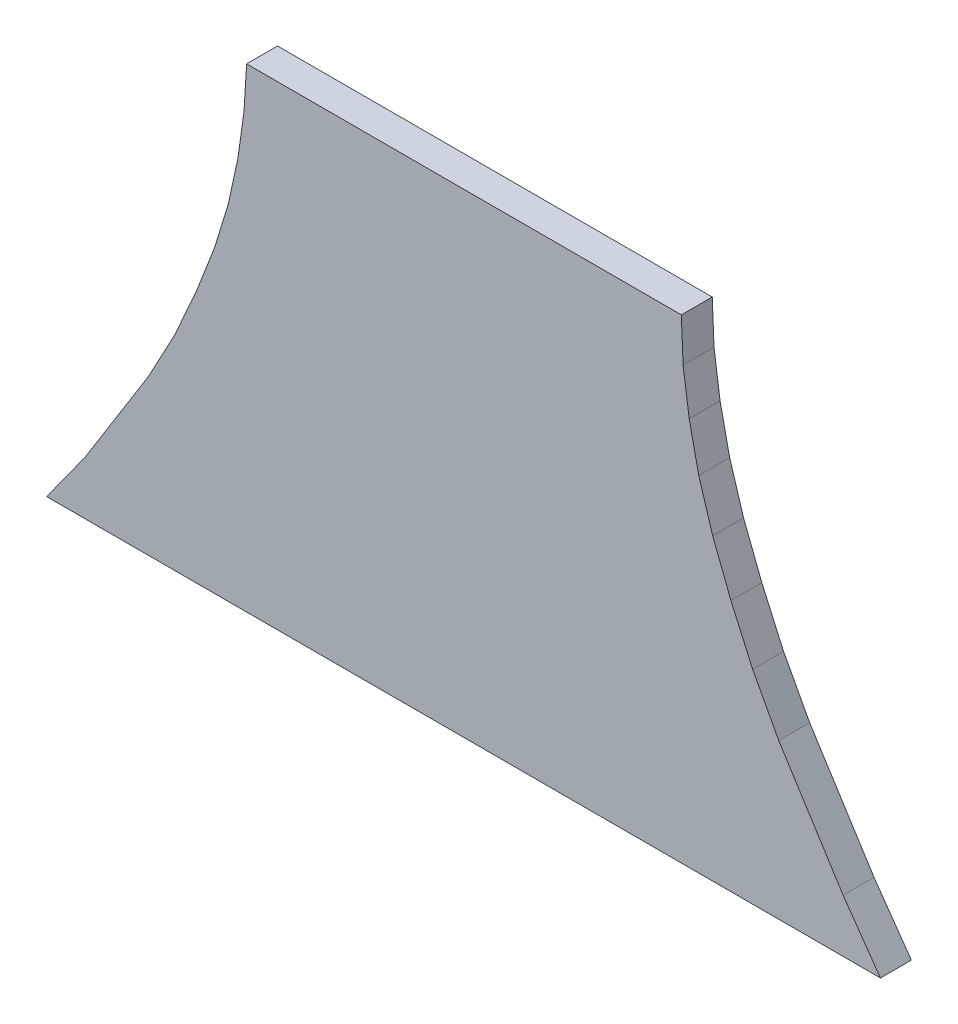
ISO-10303-21;
HEADER;
FILE_DESCRIPTION(('STEP AP214'),'2;1');
FILE_NAME('part.step','',(''),(''),'','','');
FILE_SCHEMA(('AUTOMOTIVE_DESIGN { 1 0 10303 214 1 1 1 1 }'));
ENDSEC;
DATA;
#1=APPLICATION_CONTEXT('core data for automotive mechanical design processes');
#2=APPLICATION_PROTOCOL_DEFINITION('international standard','automotive_design',2000,#1);
#3=PRODUCT_CONTEXT('',#1,'mechanical');
#4=PRODUCT('Part','Part','',(#3));
#5=PRODUCT_RELATED_PRODUCT_CATEGORY('part','',(#4));
#6=PRODUCT_DEFINITION_FORMATION('','',#4);
#7=PRODUCT_DEFINITION_CONTEXT('part definition',#1,'design');
#8=PRODUCT_DEFINITION('design','',#6,#7);
#9=PRODUCT_DEFINITION_SHAPE('','',#8);
#10=(LENGTH_UNIT() NAMED_UNIT(*) SI_UNIT(.MILLI.,.METRE.));
#11=(NAMED_UNIT(*) PLANE_ANGLE_UNIT() SI_UNIT($,.RADIAN.));
#12=(NAMED_UNIT(*) SI_UNIT($,.STERADIAN.) SOLID_ANGLE_UNIT());
#13=UNCERTAINTY_MEASURE_WITH_UNIT(LENGTH_MEASURE(1.E-05),#10,'distance_accuracy_value','');
#14=(GEOMETRIC_REPRESENTATION_CONTEXT(3) GLOBAL_UNCERTAINTY_ASSIGNED_CONTEXT((#13)) GLOBAL_UNIT_ASSIGNED_CONTEXT((#10,
#11,#12)) REPRESENTATION_CONTEXT('',''));
#15=CARTESIAN_POINT('',(0.,0.,0.));
#16=DIRECTION('',(0.,0.,1.));
#17=DIRECTION('',(1.,0.,0.));
#18=AXIS2_PLACEMENT_3D('',#15,#16,#17);
#19=CARTESIAN_POINT('',(110.217002868652,98.7460021972656,0.));
#20=DIRECTION('',(0.998123869365912,-0.0612269662977066,0.));
#21=DIRECTION('',(-0.0612269662977066,-0.998123869365912,0.));
#22=AXIS2_PLACEMENT_3D('',#19,#20,#21);
#23=PLANE('',#22);
#24=DIRECTION('',(-0.0612269662977066,-0.998123869365912,0.));
#25=VECTOR('',#24,1.);
#26=CARTESIAN_POINT('',(110.217002868652,98.7460021972656,0.03556));
#27=LINE('',#26,#25);
#28=CARTESIAN_POINT('',(110.217002868652,98.7460021972656,0.03556));
#29=VERTEX_POINT('',#28);
#30=CARTESIAN_POINT('',(110.213996887207,98.6969985961914,0.03556));
#31=VERTEX_POINT('',#30);
#32=EDGE_CURVE('E11',#29,#31,#27,.T.);
#33=ORIENTED_EDGE('',*,*,#32,.F.);
#34=DIRECTION('',(0.,0.,1.));
#35=VECTOR('',#34,1.);
#36=CARTESIAN_POINT('',(110.217002868652,98.7460021972656,0.));
#37=LINE('',#36,#35);
#38=CARTESIAN_POINT('',(110.217002868652,98.7460021972656,0.));
#39=VERTEX_POINT('',#38);
#40=EDGE_CURVE('E24',#39,#29,#37,.T.);
#41=ORIENTED_EDGE('',*,*,#40,.F.);
#42=DIRECTION('',(-0.0612269662977066,-0.998123869365912,0.));
#43=VECTOR('',#42,1.);
#44=CARTESIAN_POINT('',(110.217002868652,98.7460021972656,0.));
#45=LINE('',#44,#43);
#46=CARTESIAN_POINT('',(110.213996887207,98.6969985961914,0.));
#47=VERTEX_POINT('',#46);
#48=EDGE_CURVE('E172',#39,#47,#45,.T.);
#49=ORIENTED_EDGE('',*,*,#48,.T.);
#50=DIRECTION('',(0.,0.,1.));
#51=VECTOR('',#50,1.);
#52=CARTESIAN_POINT('',(110.213996887207,98.6969985961914,0.));
#53=LINE('',#52,#51);
#54=EDGE_CURVE('E37',#47,#31,#53,.T.);
#55=ORIENTED_EDGE('',*,*,#54,.T.);
#56=EDGE_LOOP('',(#33,#41,#49,#55));
#57=FACE_BOUND('',#56,.T.);
#58=ADVANCED_FACE('F17',(#57),#23,.F.);
#59=CARTESIAN_POINT('',(110.213996887207,98.6969985961914,0.));
#60=DIRECTION('',(0.990350460296549,-0.138585590125429,0.));
#61=DIRECTION('',(-0.138585590125429,-0.990350460296549,0.));
#62=AXIS2_PLACEMENT_3D('',#59,#60,#61);
#63=PLANE('',#62);
#64=DIRECTION('',(-0.138585590125429,-0.990350460296549,0.));
#65=VECTOR('',#64,1.);
#66=CARTESIAN_POINT('',(110.213996887207,98.6969985961914,0.03556));
#67=LINE('',#66,#65);
#68=CARTESIAN_POINT('',(110.207000732422,98.6470031738281,0.03556));
#69=VERTEX_POINT('',#68);
#70=EDGE_CURVE('E308',#31,#69,#67,.T.);
#71=ORIENTED_EDGE('',*,*,#70,.F.);
#72=ORIENTED_EDGE('',*,*,#54,.F.);
#73=DIRECTION('',(-0.138585590125429,-0.990350460296549,0.));
#74=VECTOR('',#73,1.);
#75=CARTESIAN_POINT('',(110.213996887207,98.6969985961914,0.));
#76=LINE('',#75,#74);
#77=CARTESIAN_POINT('',(110.207000732422,98.6470031738281,0.));
#78=VERTEX_POINT('',#77);
#79=EDGE_CURVE('E305',#47,#78,#76,.T.);
#80=ORIENTED_EDGE('',*,*,#79,.T.);
#81=DIRECTION('',(0.,0.,1.));
#82=VECTOR('',#81,1.);
#83=CARTESIAN_POINT('',(110.207000732422,98.6470031738281,0.));
#84=LINE('',#83,#82);
#85=EDGE_CURVE('E303',#78,#69,#84,.T.);
#86=ORIENTED_EDGE('',*,*,#85,.T.);
#87=EDGE_LOOP('',(#71,#72,#80,#86));
#88=FACE_BOUND('',#87,.T.);
#89=ADVANCED_FACE('F316',(#88),#63,.F.);
#90=CARTESIAN_POINT('',(110.207000732422,98.6470031738281,0.));
#91=DIRECTION('',(0.97751690746619,-0.210857050196895,0.));
#92=DIRECTION('',(-0.210857050196895,-0.97751690746619,0.));
#93=AXIS2_PLACEMENT_3D('',#90,#91,#92);
#94=PLANE('',#93);
#95=DIRECTION('',(-0.210857050196895,-0.97751690746619,0.));
#96=VECTOR('',#95,1.);
#97=CARTESIAN_POINT('',(110.207000732422,98.6470031738281,0.03556));
#98=LINE('',#97,#96);
#99=CARTESIAN_POINT('',(110.195999145508,98.5960006713867,0.03556));
#100=VERTEX_POINT('',#99);
#101=EDGE_CURVE('E300',#69,#100,#98,.T.);
#102=ORIENTED_EDGE('',*,*,#101,.F.);
#103=ORIENTED_EDGE('',*,*,#85,.F.);
#104=DIRECTION('',(-0.210857050196895,-0.97751690746619,0.));
#105=VECTOR('',#104,1.);
#106=CARTESIAN_POINT('',(110.207000732422,98.6470031738281,0.));
#107=LINE('',#106,#105);
#108=CARTESIAN_POINT('',(110.195999145508,98.5960006713867,0.));
#109=VERTEX_POINT('',#108);
#110=EDGE_CURVE('E297',#78,#109,#107,.T.);
#111=ORIENTED_EDGE('',*,*,#110,.T.);
#112=DIRECTION('',(0.,0.,1.));
#113=VECTOR('',#112,1.);
#114=CARTESIAN_POINT('',(110.195999145508,98.5960006713867,0.));
#115=LINE('',#114,#113);
#116=EDGE_CURVE('E295',#109,#100,#115,.T.);
#117=ORIENTED_EDGE('',*,*,#116,.T.);
#118=EDGE_LOOP('',(#102,#103,#111,#117));
#119=FACE_BOUND('',#118,.T.);
#120=ADVANCED_FACE('F322',(#119),#94,.F.);
#121=CARTESIAN_POINT('',(110.195999145508,98.5960006713867,0.));
#122=DIRECTION('',(0.955788104078501,-0.294056287302321,0.));
#123=DIRECTION('',(-0.294056287302321,-0.955788104078501,0.));
#124=AXIS2_PLACEMENT_3D('',#121,#122,#123);
#125=PLANE('',#124);
#126=DIRECTION('',(-0.294056287302321,-0.955788104078501,0.));
#127=VECTOR('',#126,1.);
#128=CARTESIAN_POINT('',(110.195999145508,98.5960006713867,0.03556));
#129=LINE('',#128,#127);
#130=CARTESIAN_POINT('',(110.180000305176,98.5439987182617,0.03556));
#131=VERTEX_POINT('',#130);
#132=EDGE_CURVE('E292',#100,#131,#129,.T.);
#133=ORIENTED_EDGE('',*,*,#132,.F.);
#134=ORIENTED_EDGE('',*,*,#116,.F.);
#135=DIRECTION('',(-0.294056287302321,-0.955788104078501,0.));
#136=VECTOR('',#135,1.);
#137=CARTESIAN_POINT('',(110.195999145508,98.5960006713867,0.));
#138=LINE('',#137,#136);
#139=CARTESIAN_POINT('',(110.180000305176,98.5439987182617,0.));
#140=VERTEX_POINT('',#139);
#141=EDGE_CURVE('E289',#109,#140,#138,.T.);
#142=ORIENTED_EDGE('',*,*,#141,.T.);
#143=DIRECTION('',(0.,0.,1.));
#144=VECTOR('',#143,1.);
#145=CARTESIAN_POINT('',(110.180000305176,98.5439987182617,0.));
#146=LINE('',#145,#144);
#147=EDGE_CURVE('E287',#140,#131,#146,.T.);
#148=ORIENTED_EDGE('',*,*,#147,.T.);
#149=EDGE_LOOP('',(#133,#134,#142,#148));
#150=FACE_BOUND('',#149,.T.);
#151=ADVANCED_FACE('F324',(#150),#125,.F.);
#152=CARTESIAN_POINT('',(110.180000305176,98.5439987182617,0.));
#153=DIRECTION('',(0.931984901482187,-0.362497094345925,0.));
#154=DIRECTION('',(-0.362497094345925,-0.931984901482187,0.));
#155=AXIS2_PLACEMENT_3D('',#152,#153,#154);
#156=PLANE('',#155);
#157=DIRECTION('',(-0.362497094345925,-0.931984901482187,0.));
#158=VECTOR('',#157,1.);
#159=CARTESIAN_POINT('',(110.180000305176,98.5439987182617,0.03556));
#160=LINE('',#159,#158);
#161=CARTESIAN_POINT('',(110.158996582031,98.4899978637695,0.03556));
#162=VERTEX_POINT('',#161);
#163=EDGE_CURVE('E284',#131,#162,#160,.T.);
#164=ORIENTED_EDGE('',*,*,#163,.F.);
#165=ORIENTED_EDGE('',*,*,#147,.F.);
#166=DIRECTION('',(-0.362497094345925,-0.931984901482187,0.));
#167=VECTOR('',#166,1.);
#168=CARTESIAN_POINT('',(110.180000305176,98.5439987182617,0.));
#169=LINE('',#168,#167);
#170=CARTESIAN_POINT('',(110.158996582031,98.4899978637695,0.));
#171=VERTEX_POINT('',#170);
#172=EDGE_CURVE('E281',#140,#171,#169,.T.);
#173=ORIENTED_EDGE('',*,*,#172,.T.);
#174=DIRECTION('',(0.,0.,1.));
#175=VECTOR('',#174,1.);
#176=CARTESIAN_POINT('',(110.158996582031,98.4899978637695,0.));
#177=LINE('',#176,#175);
#178=EDGE_CURVE('E279',#171,#162,#177,.T.);
#179=ORIENTED_EDGE('',*,*,#178,.T.);
#180=EDGE_LOOP('',(#164,#165,#173,#179));
#181=FACE_BOUND('',#180,.T.);
#182=ADVANCED_FACE('F329',(#181),#156,.F.);
#183=CARTESIAN_POINT('',(110.158996582031,98.4899978637695,0.));
#184=DIRECTION('',(0.913174265858923,-0.407569331737579,0.));
#185=DIRECTION('',(-0.407569331737579,-0.913174265858923,0.));
#186=AXIS2_PLACEMENT_3D('',#183,#184,#185);
#187=PLANE('',#186);
#188=DIRECTION('',(-0.407569331737579,-0.913174265858923,0.));
#189=VECTOR('',#188,1.);
#190=CARTESIAN_POINT('',(110.158996582031,98.4899978637695,0.03556));
#191=LINE('',#190,#189);
#192=CARTESIAN_POINT('',(110.134002685547,98.4339981079102,0.03556));
#193=VERTEX_POINT('',#192);
#194=EDGE_CURVE('E276',#162,#193,#191,.T.);
#195=ORIENTED_EDGE('',*,*,#194,.F.);
#196=ORIENTED_EDGE('',*,*,#178,.F.);
#197=DIRECTION('',(-0.407569331737579,-0.913174265858923,0.));
#198=VECTOR('',#197,1.);
#199=CARTESIAN_POINT('',(110.158996582031,98.4899978637695,0.));
#200=LINE('',#199,#198);
#201=CARTESIAN_POINT('',(110.134002685547,98.4339981079102,0.));
#202=VERTEX_POINT('',#201);
#203=EDGE_CURVE('E273',#171,#202,#200,.T.);
#204=ORIENTED_EDGE('',*,*,#203,.T.);
#205=DIRECTION('',(0.,0.,1.));
#206=VECTOR('',#205,1.);
#207=CARTESIAN_POINT('',(110.134002685547,98.4339981079102,0.));
#208=LINE('',#207,#206);
#209=EDGE_CURVE('E271',#202,#193,#208,.T.);
#210=ORIENTED_EDGE('',*,*,#209,.T.);
#211=EDGE_LOOP('',(#195,#196,#204,#210));
#212=FACE_BOUND('',#211,.T.);
#213=ADVANCED_FACE('F332',(#212),#187,.F.);
#214=CARTESIAN_POINT('',(110.134002685547,98.4339981079102,0.));
#215=DIRECTION('',(0.881437120762782,-0.472301389095371,0.));
#216=DIRECTION('',(-0.472301389095371,-0.881437120762782,0.));
#217=AXIS2_PLACEMENT_3D('',#214,#215,#216);
#218=PLANE('',#217);
#219=DIRECTION('',(-0.472301389095371,-0.881437120762782,0.));
#220=VECTOR('',#219,1.);
#221=CARTESIAN_POINT('',(110.134002685547,98.4339981079102,0.03556));
#222=LINE('',#221,#220);
#223=CARTESIAN_POINT('',(110.103996276855,98.3779983520508,0.03556));
#224=VERTEX_POINT('',#223);
#225=EDGE_CURVE('E268',#193,#224,#222,.T.);
#226=ORIENTED_EDGE('',*,*,#225,.F.);
#227=ORIENTED_EDGE('',*,*,#209,.F.);
#228=DIRECTION('',(-0.472301389095371,-0.881437120762782,0.));
#229=VECTOR('',#228,1.);
#230=CARTESIAN_POINT('',(110.134002685547,98.4339981079102,0.));
#231=LINE('',#230,#229);
#232=CARTESIAN_POINT('',(110.103996276855,98.3779983520508,0.));
#233=VERTEX_POINT('',#232);
#234=EDGE_CURVE('E265',#202,#233,#231,.T.);
#235=ORIENTED_EDGE('',*,*,#234,.T.);
#236=DIRECTION('',(0.,0.,1.));
#237=VECTOR('',#236,1.);
#238=CARTESIAN_POINT('',(110.103996276855,98.3779983520508,0.));
#239=LINE('',#238,#237);
#240=EDGE_CURVE('E263',#233,#224,#239,.T.);
#241=ORIENTED_EDGE('',*,*,#240,.T.);
#242=EDGE_LOOP('',(#226,#227,#235,#241));
#243=FACE_BOUND('',#242,.T.);
#244=ADVANCED_FACE('F337',(#243),#218,.F.);
#245=CARTESIAN_POINT('',(110.103996276855,98.3779983520508,0.));
#246=DIRECTION('',(0.848405219145403,-0.529347318994667,0.));
#247=DIRECTION('',(-0.529347318994667,-0.848405219145403,0.));
#248=AXIS2_PLACEMENT_3D('',#245,#246,#247);
#249=PLANE('',#248);
#250=DIRECTION('',(-0.529347318994667,-0.848405219145403,0.));
#251=VECTOR('',#250,1.);
#252=CARTESIAN_POINT('',(110.103996276855,98.3779983520508,0.03556));
#253=LINE('',#252,#251);
#254=CARTESIAN_POINT('',(110.03099822998,98.2610015869141,0.03556));
#255=VERTEX_POINT('',#254);
#256=EDGE_CURVE('E260',#224,#255,#253,.T.);
#257=ORIENTED_EDGE('',*,*,#256,.F.);
#258=ORIENTED_EDGE('',*,*,#240,.F.);
#259=DIRECTION('',(-0.529347318994667,-0.848405219145403,0.));
#260=VECTOR('',#259,1.);
#261=CARTESIAN_POINT('',(110.103996276855,98.3779983520508,0.));
#262=LINE('',#261,#260);
#263=CARTESIAN_POINT('',(110.03099822998,98.2610015869141,0.));
#264=VERTEX_POINT('',#263);
#265=EDGE_CURVE('E257',#233,#264,#262,.T.);
#266=ORIENTED_EDGE('',*,*,#265,.T.);
#267=DIRECTION('',(0.,0.,1.));
#268=VECTOR('',#267,1.);
#269=CARTESIAN_POINT('',(110.03099822998,98.2610015869141,0.));
#270=LINE('',#269,#268);
#271=EDGE_CURVE('E255',#264,#255,#270,.T.);
#272=ORIENTED_EDGE('',*,*,#271,.T.);
#273=EDGE_LOOP('',(#257,#258,#266,#272));
#274=FACE_BOUND('',#273,.T.);
#275=ADVANCED_FACE('F340',(#274),#249,.F.);
#276=CARTESIAN_POINT('',(110.03099822998,98.2610015869141,0.));
#277=DIRECTION('',(0.811058866055084,-0.584964542338628,0.));
#278=DIRECTION('',(-0.584964542338628,-0.811058866055084,0.));
#279=AXIS2_PLACEMENT_3D('',#276,#277,#278);
#280=PLANE('',#279);
#281=DIRECTION('',(-0.584964542338628,-0.811058866055084,0.));
#282=VECTOR('',#281,1.);
#283=CARTESIAN_POINT('',(110.03099822998,98.2610015869141,0.03556));
#284=LINE('',#283,#282);
#285=CARTESIAN_POINT('',(109.986999511719,98.1999969482422,0.03556));
#286=VERTEX_POINT('',#285);
#287=EDGE_CURVE('E252',#255,#286,#284,.T.);
#288=ORIENTED_EDGE('',*,*,#287,.F.);
#289=ORIENTED_EDGE('',*,*,#271,.F.);
#290=DIRECTION('',(-0.584964542338628,-0.811058866055084,0.));
#291=VECTOR('',#290,1.);
#292=CARTESIAN_POINT('',(110.03099822998,98.2610015869141,0.));
#293=LINE('',#292,#291);
#294=CARTESIAN_POINT('',(109.986999511719,98.1999969482422,0.));
#295=VERTEX_POINT('',#294);
#296=EDGE_CURVE('E249',#264,#295,#293,.T.);
#297=ORIENTED_EDGE('',*,*,#296,.T.);
#298=DIRECTION('',(0.,0.,1.));
#299=VECTOR('',#298,1.);
#300=CARTESIAN_POINT('',(109.986999511719,98.1999969482422,0.));
#301=LINE('',#300,#299);
#302=EDGE_CURVE('E247',#295,#286,#301,.T.);
#303=ORIENTED_EDGE('',*,*,#302,.T.);
#304=EDGE_LOOP('',(#288,#289,#297,#303));
#305=FACE_BOUND('',#304,.T.);
#306=ADVANCED_FACE('F345',(#305),#280,.F.);
#307=CARTESIAN_POINT('',(109.986999511719,98.1999969482422,0.));
#308=DIRECTION('',(0.,1.,0.));
#309=DIRECTION('',(1.,0.,0.));
#310=AXIS2_PLACEMENT_3D('',#307,#308,#309);
#311=PLANE('',#310);
#312=DIRECTION('',(1.,0.,0.));
#313=VECTOR('',#312,1.);
#314=CARTESIAN_POINT('',(109.986999511719,98.1999969482422,0.03556));
#315=LINE('',#314,#313);
#316=CARTESIAN_POINT('',(110.945999145508,98.1999969482422,0.03556));
#317=VERTEX_POINT('',#316);
#318=EDGE_CURVE('E244',#286,#317,#315,.T.);
#319=ORIENTED_EDGE('',*,*,#318,.F.);
#320=ORIENTED_EDGE('',*,*,#302,.F.);
#321=DIRECTION('',(1.,0.,0.));
#322=VECTOR('',#321,1.);
#323=CARTESIAN_POINT('',(109.986999511719,98.1999969482422,0.));
#324=LINE('',#323,#322);
#325=CARTESIAN_POINT('',(110.945999145508,98.1999969482422,0.));
#326=VERTEX_POINT('',#325);
#327=EDGE_CURVE('E241',#295,#326,#324,.T.);
#328=ORIENTED_EDGE('',*,*,#327,.T.);
#329=DIRECTION('',(0.,0.,1.));
#330=VECTOR('',#329,1.);
#331=CARTESIAN_POINT('',(110.945999145508,98.1999969482422,0.));
#332=LINE('',#331,#330);
#333=EDGE_CURVE('E239',#326,#317,#332,.T.);
#334=ORIENTED_EDGE('',*,*,#333,.T.);
#335=EDGE_LOOP('',(#319,#320,#328,#334));
#336=FACE_BOUND('',#335,.T.);
#337=ADVANCED_FACE('F348',(#336),#311,.F.);
#338=CARTESIAN_POINT('',(110.945999145508,98.1999969482422,0.));
#339=DIRECTION('',(-0.817364280598029,-0.576121196279451,0.));
#340=DIRECTION('',(-0.576121196279451,0.817364280598029,0.));
#341=AXIS2_PLACEMENT_3D('',#338,#339,#340);
#342=PLANE('',#341);
#343=DIRECTION('',(-0.576121196279451,0.817364280598029,0.));
#344=VECTOR('',#343,1.);
#345=CARTESIAN_POINT('',(110.945999145508,98.1999969482422,0.03556));
#346=LINE('',#345,#344);
#347=CARTESIAN_POINT('',(110.90299987793,98.2610015869141,0.03556));
#348=VERTEX_POINT('',#347);
#349=EDGE_CURVE('E236',#317,#348,#346,.T.);
#350=ORIENTED_EDGE('',*,*,#349,.F.);
#351=ORIENTED_EDGE('',*,*,#333,.F.);
#352=DIRECTION('',(-0.576121196279451,0.817364280598029,0.));
#353=VECTOR('',#352,1.);
#354=CARTESIAN_POINT('',(110.945999145508,98.1999969482422,0.));
#355=LINE('',#354,#353);
#356=CARTESIAN_POINT('',(110.90299987793,98.2610015869141,0.));
#357=VERTEX_POINT('',#356);
#358=EDGE_CURVE('E233',#326,#357,#355,.T.);
#359=ORIENTED_EDGE('',*,*,#358,.T.);
#360=DIRECTION('',(0.,0.,1.));
#361=VECTOR('',#360,1.);
#362=CARTESIAN_POINT('',(110.90299987793,98.2610015869141,0.));
#363=LINE('',#362,#361);
#364=EDGE_CURVE('E231',#357,#348,#363,.T.);
#365=ORIENTED_EDGE('',*,*,#364,.T.);
#366=EDGE_LOOP('',(#350,#351,#359,#365));
#367=FACE_BOUND('',#366,.T.);
#368=ADVANCED_FACE('F353',(#367),#342,.F.);
#369=CARTESIAN_POINT('',(110.90299987793,98.2610015869141,0.));
#370=DIRECTION('',(-0.845146924510356,-0.534534073741503,0.));
#371=DIRECTION('',(-0.534534073741503,0.845146924510356,0.));
#372=AXIS2_PLACEMENT_3D('',#369,#370,#371);
#373=PLANE('',#372);
#374=DIRECTION('',(-0.534534073741503,0.845146924510356,0.));
#375=VECTOR('',#374,1.);
#376=CARTESIAN_POINT('',(110.90299987793,98.2610015869141,0.03556));
#377=LINE('',#376,#375);
#378=CARTESIAN_POINT('',(110.829002380371,98.3779983520508,0.03556));
#379=VERTEX_POINT('',#378);
#380=EDGE_CURVE('E228',#348,#379,#377,.T.);
#381=ORIENTED_EDGE('',*,*,#380,.F.);
#382=ORIENTED_EDGE('',*,*,#364,.F.);
#383=DIRECTION('',(-0.534534073741503,0.845146924510356,0.));
#384=VECTOR('',#383,1.);
#385=CARTESIAN_POINT('',(110.90299987793,98.2610015869141,0.));
#386=LINE('',#385,#384);
#387=CARTESIAN_POINT('',(110.829002380371,98.3779983520508,0.));
#388=VERTEX_POINT('',#387);
#389=EDGE_CURVE('E225',#357,#388,#386,.T.);
#390=ORIENTED_EDGE('',*,*,#389,.T.);
#391=DIRECTION('',(0.,0.,1.));
#392=VECTOR('',#391,1.);
#393=CARTESIAN_POINT('',(110.829002380371,98.3779983520508,0.));
#394=LINE('',#393,#392);
#395=EDGE_CURVE('E223',#388,#379,#394,.T.);
#396=ORIENTED_EDGE('',*,*,#395,.T.);
#397=EDGE_LOOP('',(#381,#382,#390,#396));
#398=FACE_BOUND('',#397,.T.);
#399=ADVANCED_FACE('F356',(#398),#373,.F.);
#400=CARTESIAN_POINT('',(110.829002380371,98.3779983520508,0.));
#401=DIRECTION('',(-0.881487111272596,-0.472208081951478,0.));
#402=DIRECTION('',(-0.472208081951478,0.881487111272596,0.));
#403=AXIS2_PLACEMENT_3D('',#400,#401,#402);
#404=PLANE('',#403);
#405=DIRECTION('',(-0.472208081951478,0.881487111272596,0.));
#406=VECTOR('',#405,1.);
#407=CARTESIAN_POINT('',(110.829002380371,98.3779983520508,0.03556));
#408=LINE('',#407,#406);
#409=CARTESIAN_POINT('',(110.799003601074,98.4339981079102,0.03556));
#410=VERTEX_POINT('',#409);
#411=EDGE_CURVE('E220',#379,#410,#408,.T.);
#412=ORIENTED_EDGE('',*,*,#411,.F.);
#413=ORIENTED_EDGE('',*,*,#395,.F.);
#414=DIRECTION('',(-0.472208081951478,0.881487111272596,0.));
#415=VECTOR('',#414,1.);
#416=CARTESIAN_POINT('',(110.829002380371,98.3779983520508,0.));
#417=LINE('',#416,#415);
#418=CARTESIAN_POINT('',(110.799003601074,98.4339981079102,0.));
#419=VERTEX_POINT('',#418);
#420=EDGE_CURVE('E217',#388,#419,#417,.T.);
#421=ORIENTED_EDGE('',*,*,#420,.T.);
#422=DIRECTION('',(0.,0.,1.));
#423=VECTOR('',#422,1.);
#424=CARTESIAN_POINT('',(110.799003601074,98.4339981079102,0.));
#425=LINE('',#424,#423);
#426=EDGE_CURVE('E215',#419,#410,#425,.T.);
#427=ORIENTED_EDGE('',*,*,#426,.T.);
#428=EDGE_LOOP('',(#412,#413,#421,#427));
#429=FACE_BOUND('',#428,.T.);
#430=ADVANCED_FACE('F361',(#429),#404,.F.);
#431=CARTESIAN_POINT('',(110.799003601074,98.4339981079102,0.));
#432=DIRECTION('',(-0.913127958926813,-0.407673068311058,0.));
#433=DIRECTION('',(-0.407673068311058,0.913127958926813,0.));
#434=AXIS2_PLACEMENT_3D('',#431,#432,#433);
#435=PLANE('',#434);
#436=DIRECTION('',(-0.407673068311058,0.913127958926813,0.));
#437=VECTOR('',#436,1.);
#438=CARTESIAN_POINT('',(110.799003601074,98.4339981079102,0.03556));
#439=LINE('',#438,#437);
#440=CARTESIAN_POINT('',(110.774002075195,98.4899978637695,0.03556));
#441=VERTEX_POINT('',#440);
#442=EDGE_CURVE('E212',#410,#441,#439,.T.);
#443=ORIENTED_EDGE('',*,*,#442,.F.);
#444=ORIENTED_EDGE('',*,*,#426,.F.);
#445=DIRECTION('',(-0.407673068311058,0.913127958926813,0.));
#446=VECTOR('',#445,1.);
#447=CARTESIAN_POINT('',(110.799003601074,98.4339981079102,0.));
#448=LINE('',#447,#446);
#449=CARTESIAN_POINT('',(110.774002075195,98.4899978637695,0.));
#450=VERTEX_POINT('',#449);
#451=EDGE_CURVE('E209',#419,#450,#448,.T.);
#452=ORIENTED_EDGE('',*,*,#451,.T.);
#453=DIRECTION('',(0.,0.,1.));
#454=VECTOR('',#453,1.);
#455=CARTESIAN_POINT('',(110.774002075195,98.4899978637695,0.));
#456=LINE('',#455,#454);
#457=EDGE_CURVE('E207',#450,#441,#456,.T.);
#458=ORIENTED_EDGE('',*,*,#457,.T.);
#459=EDGE_LOOP('',(#443,#444,#452,#458));
#460=FACE_BOUND('',#459,.T.);
#461=ADVANCED_FACE('F364',(#460),#435,.F.);
#462=CARTESIAN_POINT('',(110.774002075195,98.4899978637695,0.));
#463=DIRECTION('',(-0.931984901482187,-0.362497094345925,0.));
#464=DIRECTION('',(-0.362497094345925,0.931984901482187,0.));
#465=AXIS2_PLACEMENT_3D('',#462,#463,#464);
#466=PLANE('',#465);
#467=DIRECTION('',(-0.362497094345925,0.931984901482187,0.));
#468=VECTOR('',#467,1.);
#469=CARTESIAN_POINT('',(110.774002075195,98.4899978637695,0.03556));
#470=LINE('',#469,#468);
#471=CARTESIAN_POINT('',(110.752998352051,98.5439987182617,0.03556));
#472=VERTEX_POINT('',#471);
#473=EDGE_CURVE('E204',#441,#472,#470,.T.);
#474=ORIENTED_EDGE('',*,*,#473,.F.);
#475=ORIENTED_EDGE('',*,*,#457,.F.);
#476=DIRECTION('',(-0.362497094345925,0.931984901482187,0.));
#477=VECTOR('',#476,1.);
#478=CARTESIAN_POINT('',(110.774002075195,98.4899978637695,0.));
#479=LINE('',#478,#477);
#480=CARTESIAN_POINT('',(110.752998352051,98.5439987182617,0.));
#481=VERTEX_POINT('',#480);
#482=EDGE_CURVE('E201',#450,#481,#479,.T.);
#483=ORIENTED_EDGE('',*,*,#482,.T.);
#484=DIRECTION('',(0.,0.,1.));
#485=VECTOR('',#484,1.);
#486=CARTESIAN_POINT('',(110.752998352051,98.5439987182617,0.));
#487=LINE('',#486,#485);
#488=EDGE_CURVE('E199',#481,#472,#487,.T.);
#489=ORIENTED_EDGE('',*,*,#488,.T.);
#490=EDGE_LOOP('',(#474,#475,#483,#489));
#491=FACE_BOUND('',#490,.T.);
#492=ADVANCED_FACE('F369',(#491),#466,.F.);
#493=CARTESIAN_POINT('',(110.752998352051,98.5439987182617,0.));
#494=DIRECTION('',(-0.955788104078501,-0.294056287302321,0.));
#495=DIRECTION('',(-0.294056287302321,0.955788104078501,0.));
#496=AXIS2_PLACEMENT_3D('',#493,#494,#495);
#497=PLANE('',#496);
#498=DIRECTION('',(-0.294056287302321,0.955788104078501,0.));
#499=VECTOR('',#498,1.);
#500=CARTESIAN_POINT('',(110.752998352051,98.5439987182617,0.03556));
#501=LINE('',#500,#499);
#502=CARTESIAN_POINT('',(110.736999511719,98.5960006713867,0.03556));
#503=VERTEX_POINT('',#502);
#504=EDGE_CURVE('E196',#472,#503,#501,.T.);
#505=ORIENTED_EDGE('',*,*,#504,.F.);
#506=ORIENTED_EDGE('',*,*,#488,.F.);
#507=DIRECTION('',(-0.294056287302321,0.955788104078501,0.));
#508=VECTOR('',#507,1.);
#509=CARTESIAN_POINT('',(110.752998352051,98.5439987182617,0.));
#510=LINE('',#509,#508);
#511=CARTESIAN_POINT('',(110.736999511719,98.5960006713867,0.));
#512=VERTEX_POINT('',#511);
#513=EDGE_CURVE('E193',#481,#512,#510,.T.);
#514=ORIENTED_EDGE('',*,*,#513,.T.);
#515=DIRECTION('',(0.,0.,1.));
#516=VECTOR('',#515,1.);
#517=CARTESIAN_POINT('',(110.736999511719,98.5960006713867,0.));
#518=LINE('',#517,#516);
#519=EDGE_CURVE('E191',#512,#503,#518,.T.);
#520=ORIENTED_EDGE('',*,*,#519,.T.);
#521=EDGE_LOOP('',(#505,#506,#514,#520));
#522=FACE_BOUND('',#521,.T.);
#523=ADVANCED_FACE('F372',(#522),#497,.F.);
#524=CARTESIAN_POINT('',(110.736999511719,98.5960006713867,0.));
#525=DIRECTION('',(-0.97751690746619,-0.210857050196895,0.));
#526=DIRECTION('',(-0.210857050196895,0.97751690746619,0.));
#527=AXIS2_PLACEMENT_3D('',#524,#525,#526);
#528=PLANE('',#527);
#529=DIRECTION('',(-0.210857050196895,0.97751690746619,0.));
#530=VECTOR('',#529,1.);
#531=CARTESIAN_POINT('',(110.736999511719,98.5960006713867,0.03556));
#532=LINE('',#531,#530);
#533=CARTESIAN_POINT('',(110.725997924805,98.6470031738281,0.03556));
#534=VERTEX_POINT('',#533);
#535=EDGE_CURVE('E188',#503,#534,#532,.T.);
#536=ORIENTED_EDGE('',*,*,#535,.F.);
#537=ORIENTED_EDGE('',*,*,#519,.F.);
#538=DIRECTION('',(-0.210857050196895,0.97751690746619,0.));
#539=VECTOR('',#538,1.);
#540=CARTESIAN_POINT('',(110.736999511719,98.5960006713867,0.));
#541=LINE('',#540,#539);
#542=CARTESIAN_POINT('',(110.725997924805,98.6470031738281,0.));
#543=VERTEX_POINT('',#542);
#544=EDGE_CURVE('E185',#512,#543,#541,.T.);
#545=ORIENTED_EDGE('',*,*,#544,.T.);
#546=DIRECTION('',(0.,0.,1.));
#547=VECTOR('',#546,1.);
#548=CARTESIAN_POINT('',(110.725997924805,98.6470031738281,0.));
#549=LINE('',#548,#547);
#550=EDGE_CURVE('E183',#543,#534,#549,.T.);
#551=ORIENTED_EDGE('',*,*,#550,.T.);
#552=EDGE_LOOP('',(#536,#537,#545,#551));
#553=FACE_BOUND('',#552,.T.);
#554=ADVANCED_FACE('F377',(#553),#528,.F.);
#555=CARTESIAN_POINT('',(110.725997924805,98.6470031738281,0.));
#556=DIRECTION('',(-0.990350460296549,-0.138585590125429,0.));
#557=DIRECTION('',(-0.138585590125429,0.990350460296549,0.));
#558=AXIS2_PLACEMENT_3D('',#555,#556,#557);
#559=PLANE('',#558);
#560=DIRECTION('',(-0.138585590125429,0.990350460296549,0.));
#561=VECTOR('',#560,1.);
#562=CARTESIAN_POINT('',(110.725997924805,98.6470031738281,0.03556));
#563=LINE('',#562,#561);
#564=CARTESIAN_POINT('',(110.71900177002,98.6969985961914,0.03556));
#565=VERTEX_POINT('',#564);
#566=EDGE_CURVE('E180',#534,#565,#563,.T.);
#567=ORIENTED_EDGE('',*,*,#566,.F.);
#568=ORIENTED_EDGE('',*,*,#550,.F.);
#569=DIRECTION('',(-0.138585590125429,0.990350460296549,0.));
#570=VECTOR('',#569,1.);
#571=CARTESIAN_POINT('',(110.725997924805,98.6470031738281,0.));
#572=LINE('',#571,#570);
#573=CARTESIAN_POINT('',(110.71900177002,98.6969985961914,0.));
#574=VERTEX_POINT('',#573);
#575=EDGE_CURVE('E178',#543,#574,#572,.T.);
#576=ORIENTED_EDGE('',*,*,#575,.T.);
#577=DIRECTION('',(0.,0.,1.));
#578=VECTOR('',#577,1.);
#579=CARTESIAN_POINT('',(110.71900177002,98.6969985961914,0.));
#580=LINE('',#579,#578);
#581=EDGE_CURVE('E163',#574,#565,#580,.T.);
#582=ORIENTED_EDGE('',*,*,#581,.T.);
#583=EDGE_LOOP('',(#567,#568,#576,#582));
#584=FACE_BOUND('',#583,.T.);
#585=ADVANCED_FACE('F379',(#584),#559,.F.);
#586=CARTESIAN_POINT('',(110.71900177002,98.6969985961914,0.));
#587=DIRECTION('',(-0.999169087696928,-0.0407570140084999,0.));
#588=DIRECTION('',(-0.0407570140084999,0.999169087696928,0.));
#589=AXIS2_PLACEMENT_3D('',#586,#587,#588);
#590=PLANE('',#589);
#591=DIRECTION('',(-0.0407570140084999,0.999169087696928,0.));
#592=VECTOR('',#591,1.);
#593=CARTESIAN_POINT('',(110.71900177002,98.6969985961914,0.03556));
#594=LINE('',#593,#592);
#595=CARTESIAN_POINT('',(110.717002868652,98.7460021972656,0.03556));
#596=VERTEX_POINT('',#595);
#597=EDGE_CURVE('E167',#565,#596,#594,.T.);
#598=ORIENTED_EDGE('',*,*,#597,.F.);
#599=ORIENTED_EDGE('',*,*,#581,.F.);
#600=DIRECTION('',(-0.0407570140084999,0.999169087696928,0.));
#601=VECTOR('',#600,1.);
#602=CARTESIAN_POINT('',(110.71900177002,98.6969985961914,0.));
#603=LINE('',#602,#601);
#604=CARTESIAN_POINT('',(110.717002868652,98.7460021972656,0.));
#605=VERTEX_POINT('',#604);
#606=EDGE_CURVE('E159',#574,#605,#603,.T.);
#607=ORIENTED_EDGE('',*,*,#606,.T.);
#608=DIRECTION('',(0.,0.,1.));
#609=VECTOR('',#608,1.);
#610=CARTESIAN_POINT('',(110.717002868652,98.7460021972656,0.));
#611=LINE('',#610,#609);
#612=EDGE_CURVE('E149',#605,#596,#611,.T.);
#613=ORIENTED_EDGE('',*,*,#612,.T.);
#614=EDGE_LOOP('',(#598,#599,#607,#613));
#615=FACE_BOUND('',#614,.T.);
#616=ADVANCED_FACE('F162',(#615),#590,.F.);
#617=CARTESIAN_POINT('',(110.717002868652,98.7460021972656,0.));
#618=DIRECTION('',(0.,-1.,0.));
#619=DIRECTION('',(-1.,0.,0.));
#620=AXIS2_PLACEMENT_3D('',#617,#618,#619);
#621=PLANE('',#620);
#622=DIRECTION('',(-1.,0.,0.));
#623=VECTOR('',#622,1.);
#624=CARTESIAN_POINT('',(110.717002868652,98.7460021972656,0.03556));
#625=LINE('',#624,#623);
#626=EDGE_CURVE('E155',#596,#29,#625,.T.);
#627=ORIENTED_EDGE('',*,*,#626,.F.);
#628=ORIENTED_EDGE('',*,*,#612,.F.);
#629=DIRECTION('',(-1.,0.,0.));
#630=VECTOR('',#629,1.);
#631=CARTESIAN_POINT('',(110.717002868652,98.7460021972656,0.));
#632=LINE('',#631,#630);
#633=EDGE_CURVE('E153',#605,#39,#632,.T.);
#634=ORIENTED_EDGE('',*,*,#633,.T.);
#635=ORIENTED_EDGE('',*,*,#40,.T.);
#636=EDGE_LOOP('',(#627,#628,#634,#635));
#637=FACE_BOUND('',#636,.T.);
#638=ADVANCED_FACE('F151',(#637),#621,.F.);
#639=CARTESIAN_POINT('',(110.217002868652,98.7460021972656,0.));
#640=DIRECTION('',(0.,0.,1.));
#641=DIRECTION('',(1.,0.,0.));
#642=AXIS2_PLACEMENT_3D('',#639,#640,#641);
#643=PLANE('',#642);
#644=ORIENTED_EDGE('',*,*,#633,.F.);
#645=ORIENTED_EDGE('',*,*,#606,.F.);
#646=ORIENTED_EDGE('',*,*,#575,.F.);
#647=ORIENTED_EDGE('',*,*,#544,.F.);
#648=ORIENTED_EDGE('',*,*,#513,.F.);
#649=ORIENTED_EDGE('',*,*,#482,.F.);
#650=ORIENTED_EDGE('',*,*,#451,.F.);
#651=ORIENTED_EDGE('',*,*,#420,.F.);
#652=ORIENTED_EDGE('',*,*,#389,.F.);
#653=ORIENTED_EDGE('',*,*,#358,.F.);
#654=ORIENTED_EDGE('',*,*,#327,.F.);
#655=ORIENTED_EDGE('',*,*,#296,.F.);
#656=ORIENTED_EDGE('',*,*,#265,.F.);
#657=ORIENTED_EDGE('',*,*,#234,.F.);
#658=ORIENTED_EDGE('',*,*,#203,.F.);
#659=ORIENTED_EDGE('',*,*,#172,.F.);
#660=ORIENTED_EDGE('',*,*,#141,.F.);
#661=ORIENTED_EDGE('',*,*,#110,.F.);
#662=ORIENTED_EDGE('',*,*,#79,.F.);
#663=ORIENTED_EDGE('',*,*,#48,.F.);
#664=EDGE_LOOP('',(#644,#645,#646,#647,#648,#649,#650,#651,#652,#653,#654,#655,#656,#657,#658,
#659,#660,#661,#662,#663));
#665=FACE_BOUND('',#664,.T.);
#666=ADVANCED_FACE('F170',(#665),#643,.F.);
#667=CARTESIAN_POINT('',(110.217002868652,98.7460021972656,0.03556));
#668=DIRECTION('',(0.,0.,1.));
#669=DIRECTION('',(1.,0.,0.));
#670=AXIS2_PLACEMENT_3D('',#667,#668,#669);
#671=PLANE('',#670);
#672=ORIENTED_EDGE('',*,*,#32,.T.);
#673=ORIENTED_EDGE('',*,*,#70,.T.);
#674=ORIENTED_EDGE('',*,*,#101,.T.);
#675=ORIENTED_EDGE('',*,*,#132,.T.);
#676=ORIENTED_EDGE('',*,*,#163,.T.);
#677=ORIENTED_EDGE('',*,*,#194,.T.);
#678=ORIENTED_EDGE('',*,*,#225,.T.);
#679=ORIENTED_EDGE('',*,*,#256,.T.);
#680=ORIENTED_EDGE('',*,*,#287,.T.);
#681=ORIENTED_EDGE('',*,*,#318,.T.);
#682=ORIENTED_EDGE('',*,*,#349,.T.);
#683=ORIENTED_EDGE('',*,*,#380,.T.);
#684=ORIENTED_EDGE('',*,*,#411,.T.);
#685=ORIENTED_EDGE('',*,*,#442,.T.);
#686=ORIENTED_EDGE('',*,*,#473,.T.);
#687=ORIENTED_EDGE('',*,*,#504,.T.);
#688=ORIENTED_EDGE('',*,*,#535,.T.);
#689=ORIENTED_EDGE('',*,*,#566,.T.);
#690=ORIENTED_EDGE('',*,*,#597,.T.);
#691=ORIENTED_EDGE('',*,*,#626,.T.);
#692=EDGE_LOOP('',(#672,#673,#674,#675,#676,#677,#678,#679,#680,#681,#682,#683,#684,#685,#686,
#687,#688,#689,#690,#691));
#693=FACE_BOUND('',#692,.T.);
#694=ADVANCED_FACE('F319',(#693),#671,.T.);
#695=CLOSED_SHELL('',(#58,#89,#120,#151,#182,#213,#244,#275,#306,#337,#368,#399,#430,#461,#492,
#523,#554,#585,#616,#638,#666,#694));
#696=MANIFOLD_SOLID_BREP('B1',#695);
#697=ADVANCED_BREP_SHAPE_REPRESENTATION('',(#18,#696),#14);
#698=SHAPE_DEFINITION_REPRESENTATION(#9,#697);
ENDSEC;
END-ISO-10303-21;
